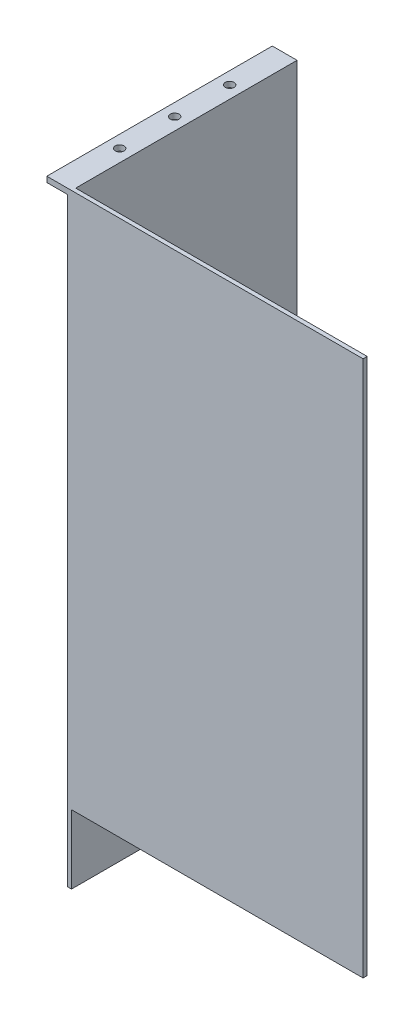
ISO-10303-21;
HEADER;
FILE_DESCRIPTION(('STEP AP214'),'2;1');
FILE_NAME('part.step','',(''),(''),'','','');
FILE_SCHEMA(('AUTOMOTIVE_DESIGN { 1 0 10303 214 1 1 1 1 }'));
ENDSEC;
DATA;
#1=APPLICATION_CONTEXT('core data for automotive mechanical design processes');
#2=APPLICATION_PROTOCOL_DEFINITION('international standard','automotive_design',2000,#1);
#3=PRODUCT_CONTEXT('',#1,'mechanical');
#4=PRODUCT('Part','Part','',(#3));
#5=PRODUCT_RELATED_PRODUCT_CATEGORY('part','',(#4));
#6=PRODUCT_DEFINITION_FORMATION('','',#4);
#7=PRODUCT_DEFINITION_CONTEXT('part definition',#1,'design');
#8=PRODUCT_DEFINITION('design','',#6,#7);
#9=PRODUCT_DEFINITION_SHAPE('','',#8);
#10=(LENGTH_UNIT() NAMED_UNIT(*) SI_UNIT(.MILLI.,.METRE.));
#11=(NAMED_UNIT(*) PLANE_ANGLE_UNIT() SI_UNIT($,.RADIAN.));
#12=(NAMED_UNIT(*) SI_UNIT($,.STERADIAN.) SOLID_ANGLE_UNIT());
#13=UNCERTAINTY_MEASURE_WITH_UNIT(LENGTH_MEASURE(1.E-05),#10,'distance_accuracy_value','');
#14=(GEOMETRIC_REPRESENTATION_CONTEXT(3) GLOBAL_UNCERTAINTY_ASSIGNED_CONTEXT((#13)) GLOBAL_UNIT_ASSIGNED_CONTEXT((#10,
#11,#12)) REPRESENTATION_CONTEXT('',''));
#15=CARTESIAN_POINT('',(0.,0.,0.));
#16=DIRECTION('',(0.,0.,1.));
#17=DIRECTION('',(1.,0.,0.));
#18=AXIS2_PLACEMENT_3D('',#15,#16,#17);
#19=CARTESIAN_POINT('',(-1.5,0.,0.));
#20=DIRECTION('',(-1.,0.,0.));
#21=DIRECTION('',(0.,-1.,0.));
#22=AXIS2_PLACEMENT_3D('',#19,#20,#21);
#23=PLANE('',#22);
#24=DIRECTION('',(0.,1.,0.));
#25=VECTOR('',#24,1.);
#26=CARTESIAN_POINT('',(-1.49999999999997,-220.,1.5));
#27=LINE('',#26,#25);
#28=CARTESIAN_POINT('',(-1.49999999999997,-220.,1.5));
#29=VERTEX_POINT('',#28);
#30=CARTESIAN_POINT('',(-1.5,-2.,1.5));
#31=VERTEX_POINT('',#30);
#32=EDGE_CURVE('E56',#29,#31,#27,.T.);
#33=ORIENTED_EDGE('',*,*,#32,.T.);
#34=DIRECTION('',(0.,0.,-1.));
#35=VECTOR('',#34,1.);
#36=CARTESIAN_POINT('',(-1.5,-2.,0.));
#37=LINE('',#36,#35);
#38=CARTESIAN_POINT('',(-1.5,-2.,-80.5));
#39=VERTEX_POINT('',#38);
#40=EDGE_CURVE('E11',#31,#39,#37,.T.);
#41=ORIENTED_EDGE('',*,*,#40,.T.);
#42=DIRECTION('',(0.,-1.,0.));
#43=VECTOR('',#42,1.);
#44=CARTESIAN_POINT('',(-1.49999999999997,-220.,-80.5));
#45=LINE('',#44,#43);
#46=CARTESIAN_POINT('',(-1.49999999999997,-220.,-80.5));
#47=VERTEX_POINT('',#46);
#48=EDGE_CURVE('E128',#39,#47,#45,.T.);
#49=ORIENTED_EDGE('',*,*,#48,.T.);
#50=DIRECTION('',(0.,0.,1.));
#51=VECTOR('',#50,1.);
#52=CARTESIAN_POINT('',(-1.49999999999997,-220.,1.5));
#53=LINE('',#52,#51);
#54=EDGE_CURVE('E140',#47,#29,#53,.T.);
#55=ORIENTED_EDGE('',*,*,#54,.T.);
#56=EDGE_LOOP('',(#33,#41,#49,#55));
#57=FACE_BOUND('',#56,.T.);
#58=ADVANCED_FACE('F36',(#57),#23,.T.);
#59=CARTESIAN_POINT('',(0.,-195.,1.5));
#60=DIRECTION('',(0.,1.,0.));
#61=DIRECTION('',(0.,0.,1.));
#62=AXIS2_PLACEMENT_3D('',#59,#60,#61);
#63=PLANE('',#62);
#64=DIRECTION('',(1.,0.,0.));
#65=VECTOR('',#64,1.);
#66=CARTESIAN_POINT('',(0.,-195.,0.));
#67=LINE('',#66,#65);
#68=CARTESIAN_POINT('',(0.,-195.,0.));
#69=VERTEX_POINT('',#68);
#70=CARTESIAN_POINT('',(106.,-195.,0.));
#71=VERTEX_POINT('',#70);
#72=EDGE_CURVE('E164',#69,#71,#67,.T.);
#73=ORIENTED_EDGE('',*,*,#72,.T.);
#74=DIRECTION('',(0.,0.,-1.));
#75=VECTOR('',#74,1.);
#76=CARTESIAN_POINT('',(106.,-195.,1.5));
#77=LINE('',#76,#75);
#78=CARTESIAN_POINT('',(106.,-195.,1.5));
#79=VERTEX_POINT('',#78);
#80=EDGE_CURVE('E172',#79,#71,#77,.T.);
#81=ORIENTED_EDGE('',*,*,#80,.F.);
#82=DIRECTION('',(1.,0.,0.));
#83=VECTOR('',#82,1.);
#84=CARTESIAN_POINT('',(0.,-195.,1.5));
#85=LINE('',#84,#83);
#86=CARTESIAN_POINT('',(0.,-195.,1.5));
#87=VERTEX_POINT('',#86);
#88=EDGE_CURVE('E155',#87,#79,#85,.T.);
#89=ORIENTED_EDGE('',*,*,#88,.F.);
#90=DIRECTION('',(0.,0.,-1.));
#91=VECTOR('',#90,1.);
#92=CARTESIAN_POINT('',(0.,-195.,1.5));
#93=LINE('',#92,#91);
#94=EDGE_CURVE('E45',#87,#69,#93,.T.);
#95=ORIENTED_EDGE('',*,*,#94,.T.);
#96=EDGE_LOOP('',(#73,#81,#89,#95));
#97=FACE_BOUND('',#96,.T.);
#98=ADVANCED_FACE('F38',(#97),#63,.F.);
#99=CARTESIAN_POINT('',(106.,0.,1.5));
#100=DIRECTION('',(-1.,0.,0.));
#101=DIRECTION('',(0.,-1.,0.));
#102=AXIS2_PLACEMENT_3D('',#99,#100,#101);
#103=PLANE('',#102);
#104=DIRECTION('',(0.,1.,0.));
#105=VECTOR('',#104,1.);
#106=CARTESIAN_POINT('',(106.,0.,0.));
#107=LINE('',#106,#105);
#108=CARTESIAN_POINT('',(106.,0.,0.));
#109=VERTEX_POINT('',#108);
#110=EDGE_CURVE('E166',#71,#109,#107,.T.);
#111=ORIENTED_EDGE('',*,*,#110,.T.);
#112=DIRECTION('',(0.,0.,-1.));
#113=VECTOR('',#112,1.);
#114=CARTESIAN_POINT('',(106.,0.,1.5));
#115=LINE('',#114,#113);
#116=CARTESIAN_POINT('',(106.,0.,1.5));
#117=VERTEX_POINT('',#116);
#118=EDGE_CURVE('E162',#117,#109,#115,.T.);
#119=ORIENTED_EDGE('',*,*,#118,.F.);
#120=DIRECTION('',(0.,1.,0.));
#121=VECTOR('',#120,1.);
#122=CARTESIAN_POINT('',(106.,0.,1.5));
#123=LINE('',#122,#121);
#124=EDGE_CURVE('E157',#79,#117,#123,.T.);
#125=ORIENTED_EDGE('',*,*,#124,.F.);
#126=ORIENTED_EDGE('',*,*,#80,.T.);
#127=EDGE_LOOP('',(#111,#119,#125,#126));
#128=FACE_BOUND('',#127,.T.);
#129=ADVANCED_FACE('F205',(#128),#103,.F.);
#130=CARTESIAN_POINT('',(0.,0.,1.5));
#131=DIRECTION('',(0.,-1.,0.));
#132=DIRECTION('',(0.,0.,-1.));
#133=AXIS2_PLACEMENT_3D('',#130,#131,#132);
#134=PLANE('',#133);
#135=CARTESIAN_POINT('',(-4.5,0.,-60.5));
#136=DIRECTION('',(0.,1.,0.));
#137=DIRECTION('',(0.,0.,1.));
#138=AXIS2_PLACEMENT_3D('',#135,#136,#137);
#139=CIRCLE('',#138,1.6);
#140=CARTESIAN_POINT('',(-4.5,0.,-58.9));
#141=VERTEX_POINT('',#140);
#142=EDGE_CURVE('E180',#141,#141,#139,.T.);
#143=ORIENTED_EDGE('',*,*,#142,.F.);
#144=EDGE_LOOP('',(#143));
#145=FACE_BOUND('',#144,.T.);
#146=CARTESIAN_POINT('',(-4.5,0.,-40.5));
#147=DIRECTION('',(0.,1.,0.));
#148=DIRECTION('',(0.,0.,1.));
#149=AXIS2_PLACEMENT_3D('',#146,#147,#148);
#150=CIRCLE('',#149,1.6);
#151=CARTESIAN_POINT('',(-4.5,0.,-38.9));
#152=VERTEX_POINT('',#151);
#153=EDGE_CURVE('E255',#152,#152,#150,.T.);
#154=ORIENTED_EDGE('',*,*,#153,.F.);
#155=EDGE_LOOP('',(#154));
#156=FACE_BOUND('',#155,.T.);
#157=CARTESIAN_POINT('',(-4.5,0.,-20.5));
#158=DIRECTION('',(0.,1.,0.));
#159=DIRECTION('',(0.,0.,1.));
#160=AXIS2_PLACEMENT_3D('',#157,#158,#159);
#161=CIRCLE('',#160,1.6);
#162=CARTESIAN_POINT('',(-4.5,0.,-18.9));
#163=VERTEX_POINT('',#162);
#164=EDGE_CURVE('E252',#163,#163,#161,.T.);
#165=ORIENTED_EDGE('',*,*,#164,.F.);
#166=EDGE_LOOP('',(#165));
#167=FACE_BOUND('',#166,.T.);
#168=DIRECTION('',(0.,0.,-1.));
#169=VECTOR('',#168,1.);
#170=CARTESIAN_POINT('',(-9.,0.,-80.5));
#171=LINE('',#170,#169);
#172=CARTESIAN_POINT('',(-9.,0.,1.5));
#173=VERTEX_POINT('',#172);
#174=CARTESIAN_POINT('',(-9.,0.,-80.5));
#175=VERTEX_POINT('',#174);
#176=EDGE_CURVE('E122',#173,#175,#171,.T.);
#177=ORIENTED_EDGE('',*,*,#176,.F.);
#178=DIRECTION('',(-1.,0.,0.));
#179=VECTOR('',#178,1.);
#180=CARTESIAN_POINT('',(0.,0.,1.5));
#181=LINE('',#180,#179);
#182=EDGE_CURVE('E160',#117,#173,#181,.T.);
#183=ORIENTED_EDGE('',*,*,#182,.F.);
#184=ORIENTED_EDGE('',*,*,#118,.T.);
#185=DIRECTION('',(-1.,0.,0.));
#186=VECTOR('',#185,1.);
#187=CARTESIAN_POINT('',(0.,0.,0.));
#188=LINE('',#187,#186);
#189=CARTESIAN_POINT('',(0.,0.,0.));
#190=VERTEX_POINT('',#189);
#191=EDGE_CURVE('E158',#109,#190,#188,.T.);
#192=ORIENTED_EDGE('',*,*,#191,.T.);
#193=DIRECTION('',(0.,0.,-1.));
#194=VECTOR('',#193,1.);
#195=CARTESIAN_POINT('',(0.,0.,1.5));
#196=LINE('',#195,#194);
#197=CARTESIAN_POINT('',(0.,0.,-80.5));
#198=VERTEX_POINT('',#197);
#199=EDGE_CURVE('E132',#190,#198,#196,.T.);
#200=ORIENTED_EDGE('',*,*,#199,.T.);
#201=DIRECTION('',(1.,0.,0.));
#202=VECTOR('',#201,1.);
#203=CARTESIAN_POINT('',(-1.5,0.,-80.5));
#204=LINE('',#203,#202);
#205=EDGE_CURVE('E152',#175,#198,#204,.T.);
#206=ORIENTED_EDGE('',*,*,#205,.F.);
#207=EDGE_LOOP('',(#177,#183,#184,#192,#200,#206));
#208=FACE_BOUND('',#207,.T.);
#209=ADVANCED_FACE('F224',(#145,#156,#167,#208),#134,.F.);
#210=CARTESIAN_POINT('',(0.,0.,1.5));
#211=DIRECTION('',(0.,0.,1.));
#212=DIRECTION('',(1.,0.,0.));
#213=AXIS2_PLACEMENT_3D('',#210,#211,#212);
#214=PLANE('',#213);
#215=DIRECTION('',(1.,0.,0.));
#216=VECTOR('',#215,1.);
#217=CARTESIAN_POINT('',(-9.,-2.,1.5));
#218=LINE('',#217,#216);
#219=CARTESIAN_POINT('',(-9.,-2.,1.5));
#220=VERTEX_POINT('',#219);
#221=EDGE_CURVE('E111',#220,#31,#218,.T.);
#222=ORIENTED_EDGE('',*,*,#221,.T.);
#223=ORIENTED_EDGE('',*,*,#32,.F.);
#224=DIRECTION('',(1.,0.,0.));
#225=VECTOR('',#224,1.);
#226=CARTESIAN_POINT('',(-1.49999999999997,-220.,1.5));
#227=LINE('',#226,#225);
#228=CARTESIAN_POINT('',(0.,-220.,1.5));
#229=VERTEX_POINT('',#228);
#230=EDGE_CURVE('E141',#29,#229,#227,.T.);
#231=ORIENTED_EDGE('',*,*,#230,.T.);
#232=DIRECTION('',(0.,1.,0.));
#233=VECTOR('',#232,1.);
#234=CARTESIAN_POINT('',(0.,-220.,1.5));
#235=LINE('',#234,#233);
#236=EDGE_CURVE('E129',#229,#87,#235,.T.);
#237=ORIENTED_EDGE('',*,*,#236,.T.);
#238=ORIENTED_EDGE('',*,*,#88,.T.);
#239=ORIENTED_EDGE('',*,*,#124,.T.);
#240=ORIENTED_EDGE('',*,*,#182,.T.);
#241=DIRECTION('',(0.,1.,0.));
#242=VECTOR('',#241,1.);
#243=CARTESIAN_POINT('',(-9.,0.,1.5));
#244=LINE('',#243,#242);
#245=EDGE_CURVE('E115',#220,#173,#244,.T.);
#246=ORIENTED_EDGE('',*,*,#245,.F.);
#247=EDGE_LOOP('',(#222,#223,#231,#237,#238,#239,#240,#246));
#248=FACE_BOUND('',#247,.T.);
#249=ADVANCED_FACE('F221',(#248),#214,.T.);
#250=CARTESIAN_POINT('',(0.,0.,0.));
#251=DIRECTION('',(0.,0.,1.));
#252=DIRECTION('',(1.,0.,0.));
#253=AXIS2_PLACEMENT_3D('',#250,#251,#252);
#254=PLANE('',#253);
#255=DIRECTION('',(0.,-1.,0.));
#256=VECTOR('',#255,1.);
#257=CARTESIAN_POINT('',(0.,0.,0.));
#258=LINE('',#257,#256);
#259=EDGE_CURVE('E154',#190,#69,#258,.T.);
#260=ORIENTED_EDGE('',*,*,#259,.F.);
#261=ORIENTED_EDGE('',*,*,#191,.F.);
#262=ORIENTED_EDGE('',*,*,#110,.F.);
#263=ORIENTED_EDGE('',*,*,#72,.F.);
#264=EDGE_LOOP('',(#260,#261,#262,#263));
#265=FACE_BOUND('',#264,.T.);
#266=ADVANCED_FACE('F213',(#265),#254,.F.);
#267=CARTESIAN_POINT('',(0.,0.,0.));
#268=DIRECTION('',(-1.,0.,0.));
#269=DIRECTION('',(0.,-1.,0.));
#270=AXIS2_PLACEMENT_3D('',#267,#268,#269);
#271=PLANE('',#270);
#272=ORIENTED_EDGE('',*,*,#259,.T.);
#273=ORIENTED_EDGE('',*,*,#94,.F.);
#274=ORIENTED_EDGE('',*,*,#236,.F.);
#275=DIRECTION('',(0.,0.,1.));
#276=VECTOR('',#275,1.);
#277=CARTESIAN_POINT('',(0.,-220.,1.5));
#278=LINE('',#277,#276);
#279=CARTESIAN_POINT('',(0.,-220.,-80.5));
#280=VERTEX_POINT('',#279);
#281=EDGE_CURVE('E138',#280,#229,#278,.T.);
#282=ORIENTED_EDGE('',*,*,#281,.F.);
#283=DIRECTION('',(0.,-1.,0.));
#284=VECTOR('',#283,1.);
#285=CARTESIAN_POINT('',(0.,-220.,-80.5));
#286=LINE('',#285,#284);
#287=EDGE_CURVE('E144',#198,#280,#286,.T.);
#288=ORIENTED_EDGE('',*,*,#287,.F.);
#289=ORIENTED_EDGE('',*,*,#199,.F.);
#290=EDGE_LOOP('',(#272,#273,#274,#282,#288,#289));
#291=FACE_BOUND('',#290,.T.);
#292=ADVANCED_FACE('F210',(#291),#271,.F.);
#293=CARTESIAN_POINT('',(-1.49999999999997,-220.,-80.5));
#294=DIRECTION('',(0.,0.,1.));
#295=DIRECTION('',(1.,0.,0.));
#296=AXIS2_PLACEMENT_3D('',#293,#294,#295);
#297=PLANE('',#296);
#298=ORIENTED_EDGE('',*,*,#287,.T.);
#299=DIRECTION('',(1.,0.,0.));
#300=VECTOR('',#299,1.);
#301=CARTESIAN_POINT('',(-1.49999999999997,-220.,-80.5));
#302=LINE('',#301,#300);
#303=EDGE_CURVE('E149',#47,#280,#302,.T.);
#304=ORIENTED_EDGE('',*,*,#303,.F.);
#305=ORIENTED_EDGE('',*,*,#48,.F.);
#306=DIRECTION('',(1.,0.,0.));
#307=VECTOR('',#306,1.);
#308=CARTESIAN_POINT('',(-9.,-2.,-80.5));
#309=LINE('',#308,#307);
#310=CARTESIAN_POINT('',(-9.,-2.,-80.5));
#311=VERTEX_POINT('',#310);
#312=EDGE_CURVE('E109',#311,#39,#309,.T.);
#313=ORIENTED_EDGE('',*,*,#312,.F.);
#314=DIRECTION('',(0.,-1.,0.));
#315=VECTOR('',#314,1.);
#316=CARTESIAN_POINT('',(-9.,0.,-80.5));
#317=LINE('',#316,#315);
#318=EDGE_CURVE('E116',#175,#311,#317,.T.);
#319=ORIENTED_EDGE('',*,*,#318,.F.);
#320=ORIENTED_EDGE('',*,*,#205,.T.);
#321=EDGE_LOOP('',(#298,#304,#305,#313,#319,#320));
#322=FACE_BOUND('',#321,.T.);
#323=ADVANCED_FACE('F126',(#322),#297,.F.);
#324=CARTESIAN_POINT('',(-1.49999999999997,-220.,1.5));
#325=DIRECTION('',(0.,1.,0.));
#326=DIRECTION('',(-1.,0.,0.));
#327=AXIS2_PLACEMENT_3D('',#324,#325,#326);
#328=PLANE('',#327);
#329=ORIENTED_EDGE('',*,*,#281,.T.);
#330=ORIENTED_EDGE('',*,*,#230,.F.);
#331=ORIENTED_EDGE('',*,*,#54,.F.);
#332=ORIENTED_EDGE('',*,*,#303,.T.);
#333=EDGE_LOOP('',(#329,#330,#331,#332));
#334=FACE_BOUND('',#333,.T.);
#335=ADVANCED_FACE('F215',(#334),#328,.F.);
#336=CARTESIAN_POINT('',(-9.,-2.,-80.5));
#337=DIRECTION('',(0.,1.,0.));
#338=DIRECTION('',(-1.,0.,0.));
#339=AXIS2_PLACEMENT_3D('',#336,#337,#338);
#340=PLANE('',#339);
#341=CARTESIAN_POINT('',(-4.5,-2.,-60.5));
#342=DIRECTION('',(0.,1.,0.));
#343=DIRECTION('',(-1.,0.,0.));
#344=AXIS2_PLACEMENT_3D('',#341,#342,#343);
#345=CIRCLE('',#344,1.6);
#346=CARTESIAN_POINT('',(-6.1,-2.,-60.5));
#347=VERTEX_POINT('',#346);
#348=EDGE_CURVE('E40',#347,#347,#345,.T.);
#349=ORIENTED_EDGE('',*,*,#348,.T.);
#350=EDGE_LOOP('',(#349));
#351=FACE_BOUND('',#350,.T.);
#352=CARTESIAN_POINT('',(-4.5,-2.,-40.5));
#353=DIRECTION('',(0.,1.,0.));
#354=DIRECTION('',(-1.,0.,0.));
#355=AXIS2_PLACEMENT_3D('',#352,#353,#354);
#356=CIRCLE('',#355,1.6);
#357=CARTESIAN_POINT('',(-6.1,-2.,-40.5));
#358=VERTEX_POINT('',#357);
#359=EDGE_CURVE('E179',#358,#358,#356,.T.);
#360=ORIENTED_EDGE('',*,*,#359,.T.);
#361=EDGE_LOOP('',(#360));
#362=FACE_BOUND('',#361,.T.);
#363=CARTESIAN_POINT('',(-4.5,-2.,-20.5));
#364=DIRECTION('',(0.,1.,0.));
#365=DIRECTION('',(-1.,0.,0.));
#366=AXIS2_PLACEMENT_3D('',#363,#364,#365);
#367=CIRCLE('',#366,1.6);
#368=CARTESIAN_POINT('',(-6.1,-2.,-20.5));
#369=VERTEX_POINT('',#368);
#370=EDGE_CURVE('E177',#369,#369,#367,.T.);
#371=ORIENTED_EDGE('',*,*,#370,.T.);
#372=EDGE_LOOP('',(#371));
#373=FACE_BOUND('',#372,.T.);
#374=ORIENTED_EDGE('',*,*,#40,.F.);
#375=ORIENTED_EDGE('',*,*,#221,.F.);
#376=DIRECTION('',(0.,0.,1.));
#377=VECTOR('',#376,1.);
#378=CARTESIAN_POINT('',(-9.,-2.,-80.5));
#379=LINE('',#378,#377);
#380=EDGE_CURVE('E105',#311,#220,#379,.T.);
#381=ORIENTED_EDGE('',*,*,#380,.F.);
#382=ORIENTED_EDGE('',*,*,#312,.T.);
#383=EDGE_LOOP('',(#374,#375,#381,#382));
#384=FACE_BOUND('',#383,.T.);
#385=ADVANCED_FACE('F107',(#351,#362,#373,#384),#340,.F.);
#386=CARTESIAN_POINT('',(-9.,0.,0.));
#387=DIRECTION('',(-1.,0.,0.));
#388=DIRECTION('',(0.,-1.,0.));
#389=AXIS2_PLACEMENT_3D('',#386,#387,#388);
#390=PLANE('',#389);
#391=ORIENTED_EDGE('',*,*,#318,.T.);
#392=ORIENTED_EDGE('',*,*,#380,.T.);
#393=ORIENTED_EDGE('',*,*,#245,.T.);
#394=ORIENTED_EDGE('',*,*,#176,.T.);
#395=EDGE_LOOP('',(#391,#392,#393,#394));
#396=FACE_BOUND('',#395,.T.);
#397=ADVANCED_FACE('F120',(#396),#390,.T.);
#398=CARTESIAN_POINT('',(-4.5,-9.,-20.5));
#399=DIRECTION('',(0.,1.,0.));
#400=DIRECTION('',(0.,0.,1.));
#401=AXIS2_PLACEMENT_3D('',#398,#399,#400);
#402=CYLINDRICAL_SURFACE('',#401,1.6);
#403=ORIENTED_EDGE('',*,*,#164,.T.);
#404=EDGE_LOOP('',(#403));
#405=FACE_BOUND('',#404,.T.);
#406=ORIENTED_EDGE('',*,*,#370,.F.);
#407=EDGE_LOOP('',(#406));
#408=FACE_BOUND('',#407,.T.);
#409=ADVANCED_FACE('F196',(#405,#408),#402,.F.);
#410=CARTESIAN_POINT('',(-4.5,-9.,-40.5));
#411=DIRECTION('',(0.,1.,0.));
#412=DIRECTION('',(0.,0.,1.));
#413=AXIS2_PLACEMENT_3D('',#410,#411,#412);
#414=CYLINDRICAL_SURFACE('',#413,1.6);
#415=ORIENTED_EDGE('',*,*,#153,.T.);
#416=EDGE_LOOP('',(#415));
#417=FACE_BOUND('',#416,.T.);
#418=ORIENTED_EDGE('',*,*,#359,.F.);
#419=EDGE_LOOP('',(#418));
#420=FACE_BOUND('',#419,.T.);
#421=ADVANCED_FACE('F190',(#417,#420),#414,.F.);
#422=CARTESIAN_POINT('',(-4.5,-9.,-60.5));
#423=DIRECTION('',(0.,1.,0.));
#424=DIRECTION('',(0.,0.,1.));
#425=AXIS2_PLACEMENT_3D('',#422,#423,#424);
#426=CYLINDRICAL_SURFACE('',#425,1.6);
#427=ORIENTED_EDGE('',*,*,#142,.T.);
#428=EDGE_LOOP('',(#427));
#429=FACE_BOUND('',#428,.T.);
#430=ORIENTED_EDGE('',*,*,#348,.F.);
#431=EDGE_LOOP('',(#430));
#432=FACE_BOUND('',#431,.T.);
#433=ADVANCED_FACE('F188',(#429,#432),#426,.F.);
#434=CLOSED_SHELL('',(#58,#98,#129,#209,#249,#266,#292,#323,#335,#385,#397,#409,#421,#433));
#435=MANIFOLD_SOLID_BREP('B2',#434);
#436=ADVANCED_BREP_SHAPE_REPRESENTATION('',(#18,#435),#14);
#437=SHAPE_DEFINITION_REPRESENTATION(#9,#436);
ENDSEC;
END-ISO-10303-21;
